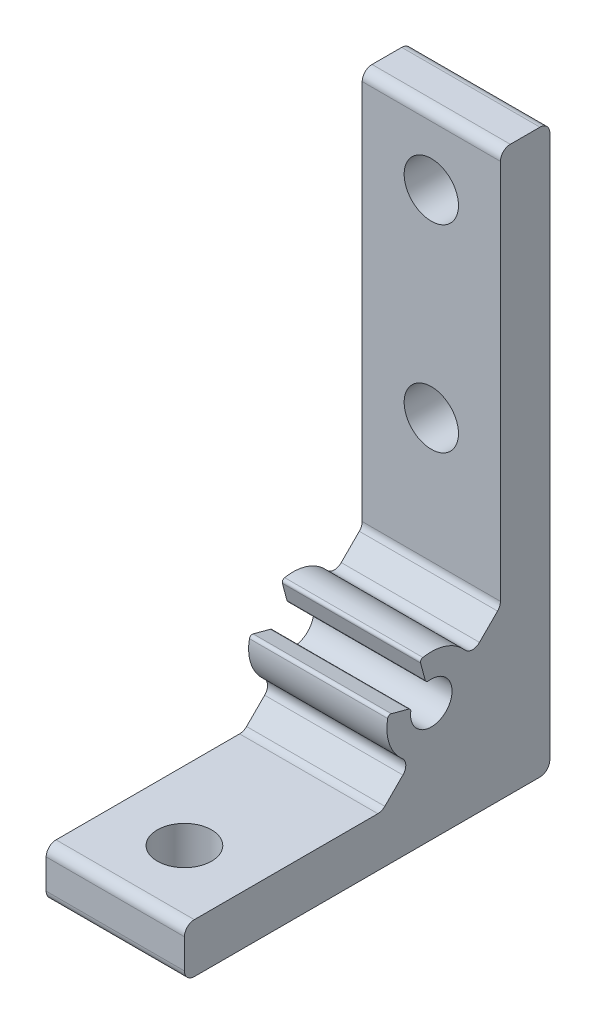
ISO-10303-21;
HEADER;
FILE_DESCRIPTION(('STEP AP214'),'2;1');
FILE_NAME('part.step','',(''),(''),'','','');
FILE_SCHEMA(('AUTOMOTIVE_DESIGN { 1 0 10303 214 1 1 1 1 }'));
ENDSEC;
DATA;
#1=APPLICATION_CONTEXT('core data for automotive mechanical design processes');
#2=APPLICATION_PROTOCOL_DEFINITION('international standard','automotive_design',2000,#1);
#3=PRODUCT_CONTEXT('',#1,'mechanical');
#4=PRODUCT('Part','Part','',(#3));
#5=PRODUCT_RELATED_PRODUCT_CATEGORY('part','',(#4));
#6=PRODUCT_DEFINITION_FORMATION('','',#4);
#7=PRODUCT_DEFINITION_CONTEXT('part definition',#1,'design');
#8=PRODUCT_DEFINITION('design','',#6,#7);
#9=PRODUCT_DEFINITION_SHAPE('','',#8);
#10=(LENGTH_UNIT() NAMED_UNIT(*) SI_UNIT(.MILLI.,.METRE.));
#11=(NAMED_UNIT(*) PLANE_ANGLE_UNIT() SI_UNIT($,.RADIAN.));
#12=(NAMED_UNIT(*) SI_UNIT($,.STERADIAN.) SOLID_ANGLE_UNIT());
#13=UNCERTAINTY_MEASURE_WITH_UNIT(LENGTH_MEASURE(1.E-05),#10,'distance_accuracy_value','');
#14=(GEOMETRIC_REPRESENTATION_CONTEXT(3) GLOBAL_UNCERTAINTY_ASSIGNED_CONTEXT((#13)) GLOBAL_UNIT_ASSIGNED_CONTEXT((#10,
#11,#12)) REPRESENTATION_CONTEXT('',''));
#15=CARTESIAN_POINT('',(0.,0.,0.));
#16=DIRECTION('',(0.,0.,1.));
#17=DIRECTION('',(1.,0.,0.));
#18=AXIS2_PLACEMENT_3D('',#15,#16,#17);
#19=CARTESIAN_POINT('',(7.,0.,36.));
#20=DIRECTION('',(0.,1.,0.));
#21=DIRECTION('',(0.,0.,1.));
#22=AXIS2_PLACEMENT_3D('',#19,#20,#21);
#23=PLANE('',#22);
#24=DIRECTION('',(-1.,0.,0.));
#25=VECTOR('',#24,1.);
#26=CARTESIAN_POINT('',(7.,0.,36.));
#27=LINE('',#26,#25);
#28=CARTESIAN_POINT('',(7.,0.,36.));
#29=VERTEX_POINT('',#28);
#30=CARTESIAN_POINT('',(-7.,0.,36.));
#31=VERTEX_POINT('',#30);
#32=EDGE_CURVE('E11',#29,#31,#27,.T.);
#33=ORIENTED_EDGE('',*,*,#32,.T.);
#34=DIRECTION('',(0.,0.,-1.));
#35=VECTOR('',#34,1.);
#36=CARTESIAN_POINT('',(-7.,0.,36.));
#37=LINE('',#36,#35);
#38=CARTESIAN_POINT('',(-7.,0.,1.));
#39=VERTEX_POINT('',#38);
#40=EDGE_CURVE('E208',#31,#39,#37,.T.);
#41=ORIENTED_EDGE('',*,*,#40,.T.);
#42=DIRECTION('',(-1.,0.,0.));
#43=VECTOR('',#42,1.);
#44=CARTESIAN_POINT('',(7.,0.,1.));
#45=LINE('',#44,#43);
#46=CARTESIAN_POINT('',(7.,0.,1.));
#47=VERTEX_POINT('',#46);
#48=EDGE_CURVE('E41',#47,#39,#45,.T.);
#49=ORIENTED_EDGE('',*,*,#48,.F.);
#50=DIRECTION('',(0.,0.,-1.));
#51=VECTOR('',#50,1.);
#52=CARTESIAN_POINT('',(7.,0.,36.));
#53=LINE('',#52,#51);
#54=EDGE_CURVE('E209',#29,#47,#53,.T.);
#55=ORIENTED_EDGE('',*,*,#54,.F.);
#56=EDGE_LOOP('',(#33,#41,#49,#55));
#57=FACE_BOUND('',#56,.T.);
#58=CARTESIAN_POINT('',(0.,0.,30.));
#59=DIRECTION('',(0.,1.,0.));
#60=DIRECTION('',(0.,0.,1.));
#61=AXIS2_PLACEMENT_3D('',#58,#59,#60);
#62=CIRCLE('',#61,2.75);
#63=CARTESIAN_POINT('',(0.,0.,32.75));
#64=VERTEX_POINT('',#63);
#65=EDGE_CURVE('E665',#64,#64,#62,.T.);
#66=ORIENTED_EDGE('',*,*,#65,.T.);
#67=EDGE_LOOP('',(#66));
#68=FACE_BOUND('',#67,.T.);
#69=ADVANCED_FACE('F33',(#57,#68),#23,.F.);
#70=CARTESIAN_POINT('',(7.,5.,17.414213562373));
#71=DIRECTION('',(0.,-1.,0.));
#72=DIRECTION('',(0.,0.,-1.));
#73=AXIS2_PLACEMENT_3D('',#70,#71,#72);
#74=PLANE('',#73);
#75=DIRECTION('',(-1.,0.,0.));
#76=VECTOR('',#75,1.);
#77=CARTESIAN_POINT('',(7.,5.,17.414213562373));
#78=LINE('',#77,#76);
#79=CARTESIAN_POINT('',(7.,5.,17.414213562373));
#80=VERTEX_POINT('',#79);
#81=CARTESIAN_POINT('',(-7.,5.,17.414213562373));
#82=VERTEX_POINT('',#81);
#83=EDGE_CURVE('E355',#80,#82,#78,.T.);
#84=ORIENTED_EDGE('',*,*,#83,.T.);
#85=DIRECTION('',(0.,0.,1.));
#86=VECTOR('',#85,1.);
#87=CARTESIAN_POINT('',(-7.,5.,17.414213562373));
#88=LINE('',#87,#86);
#89=CARTESIAN_POINT('',(-7.,5.,36.));
#90=VERTEX_POINT('',#89);
#91=EDGE_CURVE('E293',#82,#90,#88,.T.);
#92=ORIENTED_EDGE('',*,*,#91,.T.);
#93=DIRECTION('',(-1.,0.,0.));
#94=VECTOR('',#93,1.);
#95=CARTESIAN_POINT('',(7.,5.,36.));
#96=LINE('',#95,#94);
#97=CARTESIAN_POINT('',(7.,5.,36.));
#98=VERTEX_POINT('',#97);
#99=EDGE_CURVE('E353',#98,#90,#96,.T.);
#100=ORIENTED_EDGE('',*,*,#99,.F.);
#101=DIRECTION('',(0.,0.,1.));
#102=VECTOR('',#101,1.);
#103=CARTESIAN_POINT('',(7.,5.,17.414213562373));
#104=LINE('',#103,#102);
#105=EDGE_CURVE('E346',#80,#98,#104,.T.);
#106=ORIENTED_EDGE('',*,*,#105,.F.);
#107=EDGE_LOOP('',(#84,#92,#100,#106));
#108=FACE_BOUND('',#107,.T.);
#109=CARTESIAN_POINT('',(0.,5.,30.));
#110=DIRECTION('',(0.,1.,0.));
#111=DIRECTION('',(0.,0.,1.));
#112=AXIS2_PLACEMENT_3D('',#109,#110,#111);
#113=CIRCLE('',#112,2.75);
#114=CARTESIAN_POINT('',(0.,5.,32.75));
#115=VERTEX_POINT('',#114);
#116=EDGE_CURVE('E662',#115,#115,#113,.T.);
#117=ORIENTED_EDGE('',*,*,#116,.F.);
#118=EDGE_LOOP('',(#117));
#119=FACE_BOUND('',#118,.T.);
#120=ADVANCED_FACE('F506',(#108,#119),#74,.F.);
#121=CARTESIAN_POINT('',(7.,1.,0.));
#122=DIRECTION('',(0.,0.,1.));
#123=DIRECTION('',(1.,0.,0.));
#124=AXIS2_PLACEMENT_3D('',#121,#122,#123);
#125=PLANE('',#124);
#126=CARTESIAN_POINT('',(0.,30.,0.));
#127=DIRECTION('',(0.,0.,1.));
#128=DIRECTION('',(1.,0.,0.));
#129=AXIS2_PLACEMENT_3D('',#126,#127,#128);
#130=CIRCLE('',#129,2.75);
#131=CARTESIAN_POINT('',(2.75,30.,0.));
#132=VERTEX_POINT('',#131);
#133=EDGE_CURVE('E228',#132,#132,#130,.T.);
#134=ORIENTED_EDGE('',*,*,#133,.T.);
#135=EDGE_LOOP('',(#134));
#136=FACE_BOUND('',#135,.T.);
#137=DIRECTION('',(-1.,0.,0.));
#138=VECTOR('',#137,1.);
#139=CARTESIAN_POINT('',(7.,1.,0.));
#140=LINE('',#139,#138);
#141=CARTESIAN_POINT('',(7.,1.,0.));
#142=VERTEX_POINT('',#141);
#143=CARTESIAN_POINT('',(-7.,1.,0.));
#144=VERTEX_POINT('',#143);
#145=EDGE_CURVE('E395',#142,#144,#140,.T.);
#146=ORIENTED_EDGE('',*,*,#145,.T.);
#147=DIRECTION('',(0.,1.,0.));
#148=VECTOR('',#147,1.);
#149=CARTESIAN_POINT('',(-7.,1.,0.));
#150=LINE('',#149,#148);
#151=CARTESIAN_POINT('',(-7.,56.,0.));
#152=VERTEX_POINT('',#151);
#153=EDGE_CURVE('E233',#144,#152,#150,.T.);
#154=ORIENTED_EDGE('',*,*,#153,.T.);
#155=DIRECTION('',(-1.,0.,0.));
#156=VECTOR('',#155,1.);
#157=CARTESIAN_POINT('',(7.,56.,0.));
#158=LINE('',#157,#156);
#159=CARTESIAN_POINT('',(7.,56.,0.));
#160=VERTEX_POINT('',#159);
#161=EDGE_CURVE('E393',#160,#152,#158,.T.);
#162=ORIENTED_EDGE('',*,*,#161,.F.);
#163=DIRECTION('',(0.,1.,0.));
#164=VECTOR('',#163,1.);
#165=CARTESIAN_POINT('',(7.,1.,0.));
#166=LINE('',#165,#164);
#167=EDGE_CURVE('E306',#142,#160,#166,.T.);
#168=ORIENTED_EDGE('',*,*,#167,.F.);
#169=EDGE_LOOP('',(#146,#154,#162,#168));
#170=FACE_BOUND('',#169,.T.);
#171=CARTESIAN_POINT('',(0.,50.,0.));
#172=DIRECTION('',(0.,0.,1.));
#173=DIRECTION('',(1.,0.,0.));
#174=AXIS2_PLACEMENT_3D('',#171,#172,#173);
#175=CIRCLE('',#174,2.75);
#176=CARTESIAN_POINT('',(2.75,50.,0.));
#177=VERTEX_POINT('',#176);
#178=EDGE_CURVE('E667',#177,#177,#175,.T.);
#179=ORIENTED_EDGE('',*,*,#178,.T.);
#180=EDGE_LOOP('',(#179));
#181=FACE_BOUND('',#180,.T.);
#182=ADVANCED_FACE('F406',(#136,#170,#181),#125,.F.);
#183=CARTESIAN_POINT('',(7.,56.,5.));
#184=DIRECTION('',(0.,0.,-1.));
#185=DIRECTION('',(-1.,0.,0.));
#186=AXIS2_PLACEMENT_3D('',#183,#184,#185);
#187=PLANE('',#186);
#188=CARTESIAN_POINT('',(0.,30.,5.));
#189=DIRECTION('',(0.,0.,1.));
#190=DIRECTION('',(1.,0.,0.));
#191=AXIS2_PLACEMENT_3D('',#188,#189,#190);
#192=CIRCLE('',#191,2.75);
#193=CARTESIAN_POINT('',(2.75,30.,5.));
#194=VERTEX_POINT('',#193);
#195=EDGE_CURVE('E225',#194,#194,#192,.T.);
#196=ORIENTED_EDGE('',*,*,#195,.F.);
#197=EDGE_LOOP('',(#196));
#198=FACE_BOUND('',#197,.T.);
#199=DIRECTION('',(-1.,0.,0.));
#200=VECTOR('',#199,1.);
#201=CARTESIAN_POINT('',(7.,56.,5.));
#202=LINE('',#201,#200);
#203=CARTESIAN_POINT('',(7.,56.,5.));
#204=VERTEX_POINT('',#203);
#205=CARTESIAN_POINT('',(-7.,56.,5.));
#206=VERTEX_POINT('',#205);
#207=EDGE_CURVE('E387',#204,#206,#202,.T.);
#208=ORIENTED_EDGE('',*,*,#207,.T.);
#209=DIRECTION('',(0.,-1.,0.));
#210=VECTOR('',#209,1.);
#211=CARTESIAN_POINT('',(-7.,56.,5.));
#212=LINE('',#211,#210);
#213=CARTESIAN_POINT('',(-7.,17.414213562373,5.));
#214=VERTEX_POINT('',#213);
#215=EDGE_CURVE('E245',#206,#214,#212,.T.);
#216=ORIENTED_EDGE('',*,*,#215,.T.);
#217=DIRECTION('',(-1.,0.,0.));
#218=VECTOR('',#217,1.);
#219=CARTESIAN_POINT('',(7.,17.414213562373,5.));
#220=LINE('',#219,#218);
#221=CARTESIAN_POINT('',(7.,17.414213562373,5.));
#222=VERTEX_POINT('',#221);
#223=EDGE_CURVE('E385',#222,#214,#220,.T.);
#224=ORIENTED_EDGE('',*,*,#223,.F.);
#225=DIRECTION('',(0.,-1.,0.));
#226=VECTOR('',#225,1.);
#227=CARTESIAN_POINT('',(7.,56.,5.));
#228=LINE('',#227,#226);
#229=EDGE_CURVE('E314',#204,#222,#228,.T.);
#230=ORIENTED_EDGE('',*,*,#229,.F.);
#231=EDGE_LOOP('',(#208,#216,#224,#230));
#232=FACE_BOUND('',#231,.T.);
#233=CARTESIAN_POINT('',(0.,50.,5.));
#234=DIRECTION('',(0.,0.,1.));
#235=DIRECTION('',(1.,0.,0.));
#236=AXIS2_PLACEMENT_3D('',#233,#234,#235);
#237=CIRCLE('',#236,2.75);
#238=CARTESIAN_POINT('',(2.75,50.,5.));
#239=VERTEX_POINT('',#238);
#240=EDGE_CURVE('E670',#239,#239,#237,.T.);
#241=ORIENTED_EDGE('',*,*,#240,.F.);
#242=EDGE_LOOP('',(#241));
#243=FACE_BOUND('',#242,.T.);
#244=ADVANCED_FACE('F425',(#198,#232,#243),#187,.F.);
#245=CARTESIAN_POINT('',(7.,0.99999999999922,36.0000000000008));
#246=DIRECTION('',(-1.,0.,0.));
#247=DIRECTION('',(0.,0.,1.));
#248=AXIS2_PLACEMENT_3D('',#245,#246,#247);
#249=CYLINDRICAL_SURFACE('',#248,0.999999999999219);
#250=DIRECTION('',(-1.,0.,0.));
#251=VECTOR('',#250,1.);
#252=CARTESIAN_POINT('',(7.,1.,37.));
#253=LINE('',#252,#251);
#254=CARTESIAN_POINT('',(7.,1.,37.));
#255=VERTEX_POINT('',#254);
#256=CARTESIAN_POINT('',(-7.,1.,37.));
#257=VERTEX_POINT('',#256);
#258=EDGE_CURVE('E224',#255,#257,#253,.T.);
#259=ORIENTED_EDGE('',*,*,#258,.T.);
#260=CARTESIAN_POINT('',(-7.,0.99999999999922,36.0000000000008));
#261=DIRECTION('',(1.,0.,0.));
#262=DIRECTION('',(0.,0.,-1.));
#263=AXIS2_PLACEMENT_3D('',#260,#261,#262);
#264=CIRCLE('',#263,0.999999999999219);
#265=EDGE_CURVE('E218',#257,#31,#264,.T.);
#266=ORIENTED_EDGE('',*,*,#265,.T.);
#267=ORIENTED_EDGE('',*,*,#32,.F.);
#268=CARTESIAN_POINT('',(7.,0.99999999999922,36.0000000000008));
#269=DIRECTION('',(1.,0.,0.));
#270=DIRECTION('',(0.,0.,-1.));
#271=AXIS2_PLACEMENT_3D('',#268,#269,#270);
#272=CIRCLE('',#271,0.999999999999219);
#273=EDGE_CURVE('E301',#255,#29,#272,.T.);
#274=ORIENTED_EDGE('',*,*,#273,.F.);
#275=EDGE_LOOP('',(#259,#266,#267,#274));
#276=FACE_BOUND('',#275,.T.);
#277=ADVANCED_FACE('F35',(#276),#249,.T.);
#278=CARTESIAN_POINT('',(7.,0.999999999999992,0.999999999999992));
#279=DIRECTION('',(-1.,0.,0.));
#280=DIRECTION('',(0.,0.,1.));
#281=AXIS2_PLACEMENT_3D('',#278,#279,#280);
#282=CYLINDRICAL_SURFACE('',#281,0.999999999999992);
#283=ORIENTED_EDGE('',*,*,#48,.T.);
#284=CARTESIAN_POINT('',(-7.,0.999999999999992,0.999999999999992));
#285=DIRECTION('',(1.,0.,0.));
#286=DIRECTION('',(0.,0.,-1.));
#287=AXIS2_PLACEMENT_3D('',#284,#285,#286);
#288=CIRCLE('',#287,0.999999999999992);
#289=EDGE_CURVE('E222',#39,#144,#288,.T.);
#290=ORIENTED_EDGE('',*,*,#289,.T.);
#291=ORIENTED_EDGE('',*,*,#145,.F.);
#292=CARTESIAN_POINT('',(7.,0.999999999999992,0.999999999999992));
#293=DIRECTION('',(1.,0.,0.));
#294=DIRECTION('',(0.,0.,-1.));
#295=AXIS2_PLACEMENT_3D('',#292,#293,#294);
#296=CIRCLE('',#295,0.999999999999992);
#297=EDGE_CURVE('E304',#47,#142,#296,.T.);
#298=ORIENTED_EDGE('',*,*,#297,.F.);
#299=EDGE_LOOP('',(#283,#290,#291,#298));
#300=FACE_BOUND('',#299,.T.);
#301=ADVANCED_FACE('F398',(#300),#282,.T.);
#302=CARTESIAN_POINT('',(7.,56.0000000000008,0.999999999999232));
#303=DIRECTION('',(-1.,0.,0.));
#304=DIRECTION('',(0.,0.,1.));
#305=AXIS2_PLACEMENT_3D('',#302,#303,#304);
#306=CYLINDRICAL_SURFACE('',#305,0.999999999999231);
#307=ORIENTED_EDGE('',*,*,#161,.T.);
#308=CARTESIAN_POINT('',(-7.,56.0000000000008,0.999999999999232));
#309=DIRECTION('',(1.,0.,0.));
#310=DIRECTION('',(0.,0.,-1.));
#311=AXIS2_PLACEMENT_3D('',#308,#309,#310);
#312=CIRCLE('',#311,0.999999999999231);
#313=CARTESIAN_POINT('',(-7.,57.,1.));
#314=VERTEX_POINT('',#313);
#315=EDGE_CURVE('E236',#152,#314,#312,.T.);
#316=ORIENTED_EDGE('',*,*,#315,.T.);
#317=DIRECTION('',(-1.,0.,0.));
#318=VECTOR('',#317,1.);
#319=CARTESIAN_POINT('',(7.,57.,1.));
#320=LINE('',#319,#318);
#321=CARTESIAN_POINT('',(7.,57.,1.));
#322=VERTEX_POINT('',#321);
#323=EDGE_CURVE('E391',#322,#314,#320,.T.);
#324=ORIENTED_EDGE('',*,*,#323,.F.);
#325=CARTESIAN_POINT('',(7.,56.0000000000008,0.999999999999232));
#326=DIRECTION('',(1.,0.,0.));
#327=DIRECTION('',(0.,0.,-1.));
#328=AXIS2_PLACEMENT_3D('',#325,#326,#327);
#329=CIRCLE('',#328,0.999999999999231);
#330=EDGE_CURVE('E308',#160,#322,#329,.T.);
#331=ORIENTED_EDGE('',*,*,#330,.F.);
#332=EDGE_LOOP('',(#307,#316,#324,#331));
#333=FACE_BOUND('',#332,.T.);
#334=ADVANCED_FACE('F410',(#333),#306,.T.);
#335=CARTESIAN_POINT('',(7.,57.,1.));
#336=DIRECTION('',(0.,-1.,0.));
#337=DIRECTION('',(0.,0.,-1.));
#338=AXIS2_PLACEMENT_3D('',#335,#336,#337);
#339=PLANE('',#338);
#340=ORIENTED_EDGE('',*,*,#323,.T.);
#341=DIRECTION('',(0.,0.,1.));
#342=VECTOR('',#341,1.);
#343=CARTESIAN_POINT('',(-7.,57.,1.));
#344=LINE('',#343,#342);
#345=CARTESIAN_POINT('',(-7.,57.,4.));
#346=VERTEX_POINT('',#345);
#347=EDGE_CURVE('E239',#314,#346,#344,.T.);
#348=ORIENTED_EDGE('',*,*,#347,.T.);
#349=DIRECTION('',(-1.,0.,0.));
#350=VECTOR('',#349,1.);
#351=CARTESIAN_POINT('',(7.,57.,4.));
#352=LINE('',#351,#350);
#353=CARTESIAN_POINT('',(7.,57.,4.));
#354=VERTEX_POINT('',#353);
#355=EDGE_CURVE('E389',#354,#346,#352,.T.);
#356=ORIENTED_EDGE('',*,*,#355,.F.);
#357=DIRECTION('',(0.,0.,1.));
#358=VECTOR('',#357,1.);
#359=CARTESIAN_POINT('',(7.,57.,1.));
#360=LINE('',#359,#358);
#361=EDGE_CURVE('E310',#322,#354,#360,.T.);
#362=ORIENTED_EDGE('',*,*,#361,.F.);
#363=EDGE_LOOP('',(#340,#348,#356,#362));
#364=FACE_BOUND('',#363,.T.);
#365=ADVANCED_FACE('F415',(#364),#339,.F.);
#366=CARTESIAN_POINT('',(7.,56.0000000000007,4.00000000000068));
#367=DIRECTION('',(-1.,0.,0.));
#368=DIRECTION('',(0.,0.,1.));
#369=AXIS2_PLACEMENT_3D('',#366,#367,#368);
#370=CYLINDRICAL_SURFACE('',#369,0.999999999999316);
#371=ORIENTED_EDGE('',*,*,#355,.T.);
#372=CARTESIAN_POINT('',(-7.,56.0000000000007,4.00000000000068));
#373=DIRECTION('',(1.,0.,0.));
#374=DIRECTION('',(0.,0.,-1.));
#375=AXIS2_PLACEMENT_3D('',#372,#373,#374);
#376=CIRCLE('',#375,0.999999999999316);
#377=EDGE_CURVE('E242',#346,#206,#376,.T.);
#378=ORIENTED_EDGE('',*,*,#377,.T.);
#379=ORIENTED_EDGE('',*,*,#207,.F.);
#380=CARTESIAN_POINT('',(7.,56.0000000000007,4.00000000000068));
#381=DIRECTION('',(1.,0.,0.));
#382=DIRECTION('',(0.,0.,-1.));
#383=AXIS2_PLACEMENT_3D('',#380,#381,#382);
#384=CIRCLE('',#383,0.999999999999316);
#385=EDGE_CURVE('E312',#354,#204,#384,.T.);
#386=ORIENTED_EDGE('',*,*,#385,.F.);
#387=EDGE_LOOP('',(#371,#378,#379,#386));
#388=FACE_BOUND('',#387,.T.);
#389=ADVANCED_FACE('F421',(#388),#370,.T.);
#390=CARTESIAN_POINT('',(7.,17.4142135623726,5.99999999999751));
#391=DIRECTION('',(-1.,0.,0.));
#392=DIRECTION('',(0.,0.,1.));
#393=AXIS2_PLACEMENT_3D('',#390,#391,#392);
#394=CYLINDRICAL_SURFACE('',#393,0.999999999997506);
#395=ORIENTED_EDGE('',*,*,#223,.T.);
#396=CARTESIAN_POINT('',(-7.,17.4142135623726,5.99999999999751));
#397=DIRECTION('',(-1.,0.,0.));
#398=DIRECTION('',(0.,0.,1.));
#399=AXIS2_PLACEMENT_3D('',#396,#397,#398);
#400=CIRCLE('',#399,0.999999999997506);
#401=CARTESIAN_POINT('',(-7.,16.707106781187,5.2928932188135));
#402=VERTEX_POINT('',#401);
#403=EDGE_CURVE('E248',#214,#402,#400,.T.);
#404=ORIENTED_EDGE('',*,*,#403,.T.);
#405=DIRECTION('',(-1.,0.,0.));
#406=VECTOR('',#405,1.);
#407=CARTESIAN_POINT('',(7.,16.707106781187,5.2928932188135));
#408=LINE('',#407,#406);
#409=CARTESIAN_POINT('',(7.,16.707106781187,5.2928932188135));
#410=VERTEX_POINT('',#409);
#411=EDGE_CURVE('E383',#410,#402,#408,.T.);
#412=ORIENTED_EDGE('',*,*,#411,.F.);
#413=CARTESIAN_POINT('',(7.,17.4142135623726,5.99999999999751));
#414=DIRECTION('',(-1.,0.,0.));
#415=DIRECTION('',(0.,0.,1.));
#416=AXIS2_PLACEMENT_3D('',#413,#414,#415);
#417=CIRCLE('',#416,0.999999999997506);
#418=EDGE_CURVE('E316',#222,#410,#417,.T.);
#419=ORIENTED_EDGE('',*,*,#418,.F.);
#420=EDGE_LOOP('',(#395,#404,#412,#419));
#421=FACE_BOUND('',#420,.T.);
#422=ADVANCED_FACE('F431',(#421),#394,.F.);
#423=CARTESIAN_POINT('',(7.,16.707106781187,5.2928932188135));
#424=DIRECTION('',(0.,-0.70710678118647,-0.707106781186625));
#425=DIRECTION('',(0.,0.707106781186625,-0.70710678118647));
#426=AXIS2_PLACEMENT_3D('',#423,#424,#425);
#427=PLANE('',#426);
#428=ORIENTED_EDGE('',*,*,#411,.T.);
#429=DIRECTION('',(0.,-0.707106781186625,0.70710678118647));
#430=VECTOR('',#429,1.);
#431=CARTESIAN_POINT('',(-7.,16.707106781187,5.2928932188135));
#432=LINE('',#431,#430);
#433=CARTESIAN_POINT('',(-7.,14.878042491048,7.1219575089521));
#434=VERTEX_POINT('',#433);
#435=EDGE_CURVE('E251',#402,#434,#432,.T.);
#436=ORIENTED_EDGE('',*,*,#435,.T.);
#437=DIRECTION('',(-1.,0.,0.));
#438=VECTOR('',#437,1.);
#439=CARTESIAN_POINT('',(7.,14.878042491048,7.1219575089521));
#440=LINE('',#439,#438);
#441=CARTESIAN_POINT('',(7.,14.878042491048,7.1219575089521));
#442=VERTEX_POINT('',#441);
#443=EDGE_CURVE('E381',#442,#434,#440,.T.);
#444=ORIENTED_EDGE('',*,*,#443,.F.);
#445=DIRECTION('',(0.,-0.707106781186625,0.70710678118647));
#446=VECTOR('',#445,1.);
#447=CARTESIAN_POINT('',(7.,16.707106781187,5.2928932188135));
#448=LINE('',#447,#446);
#449=EDGE_CURVE('E318',#410,#442,#448,.T.);
#450=ORIENTED_EDGE('',*,*,#449,.F.);
#451=EDGE_LOOP('',(#428,#436,#444,#450));
#452=FACE_BOUND('',#451,.T.);
#453=ADVANCED_FACE('F437',(#452),#427,.F.);
#454=CARTESIAN_POINT('',(7.,15.585149272235,7.8290642901386));
#455=DIRECTION('',(-1.,0.,0.));
#456=DIRECTION('',(0.,0.,1.));
#457=AXIS2_PLACEMENT_3D('',#454,#455,#456);
#458=CYLINDRICAL_SURFACE('',#457,1.00000000000032);
#459=ORIENTED_EDGE('',*,*,#443,.T.);
#460=CARTESIAN_POINT('',(-7.,15.585149272235,7.8290642901386));
#461=DIRECTION('',(-1.,0.,0.));
#462=DIRECTION('',(0.,0.,1.));
#463=AXIS2_PLACEMENT_3D('',#460,#461,#462);
#464=CIRCLE('',#463,1.00000000000032);
#465=CARTESIAN_POINT('',(-7.,14.933303979908,8.587416263085));
#466=VERTEX_POINT('',#465);
#467=EDGE_CURVE('E254',#434,#466,#464,.T.);
#468=ORIENTED_EDGE('',*,*,#467,.T.);
#469=DIRECTION('',(-1.,0.,0.));
#470=VECTOR('',#469,1.);
#471=CARTESIAN_POINT('',(7.,14.933303979908,8.587416263085));
#472=LINE('',#471,#470);
#473=CARTESIAN_POINT('',(7.,14.933303979908,8.587416263085));
#474=VERTEX_POINT('',#473);
#475=EDGE_CURVE('E379',#474,#466,#472,.T.);
#476=ORIENTED_EDGE('',*,*,#475,.F.);
#477=CARTESIAN_POINT('',(7.,15.585149272235,7.8290642901386));
#478=DIRECTION('',(-1.,0.,0.));
#479=DIRECTION('',(0.,0.,1.));
#480=AXIS2_PLACEMENT_3D('',#477,#478,#479);
#481=CIRCLE('',#480,1.00000000000032);
#482=EDGE_CURVE('E320',#442,#474,#481,.T.);
#483=ORIENTED_EDGE('',*,*,#482,.F.);
#484=EDGE_LOOP('',(#459,#468,#476,#483));
#485=FACE_BOUND('',#484,.T.);
#486=ADVANCED_FACE('F441',(#485),#458,.F.);
#487=CARTESIAN_POINT('',(7.,12.0000000000021,11.9999999999993));
#488=DIRECTION('',(-1.,0.,0.));
#489=DIRECTION('',(0.,0.,1.));
#490=AXIS2_PLACEMENT_3D('',#487,#488,#489);
#491=CYLINDRICAL_SURFACE('',#490,4.49999999999816);
#492=ORIENTED_EDGE('',*,*,#475,.T.);
#493=CARTESIAN_POINT('',(-7.,12.0000000000021,11.9999999999993));
#494=DIRECTION('',(1.,0.,0.));
#495=DIRECTION('',(0.,0.,-1.));
#496=AXIS2_PLACEMENT_3D('',#493,#494,#495);
#497=CIRCLE('',#496,4.49999999999816);
#498=CARTESIAN_POINT('',(-7.,16.418755456335,12.851234525328));
#499=VERTEX_POINT('',#498);
#500=EDGE_CURVE('E257',#466,#499,#497,.T.);
#501=ORIENTED_EDGE('',*,*,#500,.T.);
#502=DIRECTION('',(-1.,0.,0.));
#503=VECTOR('',#502,1.);
#504=CARTESIAN_POINT('',(7.,16.418755456335,12.851234525328));
#505=LINE('',#504,#503);
#506=CARTESIAN_POINT('',(7.,16.418755456335,12.851234525328));
#507=VERTEX_POINT('',#506);
#508=EDGE_CURVE('E377',#507,#499,#505,.T.);
#509=ORIENTED_EDGE('',*,*,#508,.F.);
#510=CARTESIAN_POINT('',(7.,12.0000000000021,11.9999999999993));
#511=DIRECTION('',(1.,0.,0.));
#512=DIRECTION('',(0.,0.,-1.));
#513=AXIS2_PLACEMENT_3D('',#510,#511,#512);
#514=CIRCLE('',#513,4.49999999999816);
#515=EDGE_CURVE('E322',#474,#507,#514,.T.);
#516=ORIENTED_EDGE('',*,*,#515,.F.);
#517=EDGE_LOOP('',(#492,#501,#509,#516));
#518=FACE_BOUND('',#517,.T.);
#519=ADVANCED_FACE('F446',(#518),#491,.T.);
#520=CARTESIAN_POINT('',(7.,16.1241717443634,12.7944856342257));
#521=DIRECTION('',(-1.,0.,0.));
#522=DIRECTION('',(0.,0.,1.));
#523=AXIS2_PLACEMENT_3D('',#520,#521,#522);
#524=CYLINDRICAL_SURFACE('',#523,0.300000000000489);
#525=ORIENTED_EDGE('',*,*,#508,.T.);
#526=CARTESIAN_POINT('',(-7.,16.1241717443634,12.7944856342257));
#527=DIRECTION('',(1.,0.,0.));
#528=DIRECTION('',(0.,0.,-1.));
#529=AXIS2_PLACEMENT_3D('',#526,#527,#528);
#530=CIRCLE('',#529,0.300000000000489);
#531=CARTESIAN_POINT('',(-7.,16.046526030833,13.084263382113));
#532=VERTEX_POINT('',#531);
#533=EDGE_CURVE('E260',#499,#532,#530,.T.);
#534=ORIENTED_EDGE('',*,*,#533,.T.);
#535=DIRECTION('',(-1.,0.,0.));
#536=VECTOR('',#535,1.);
#537=CARTESIAN_POINT('',(7.,16.046526030833,13.084263382113));
#538=LINE('',#537,#536);
#539=CARTESIAN_POINT('',(7.,16.046526030833,13.084263382113));
#540=VERTEX_POINT('',#539);
#541=EDGE_CURVE('E375',#540,#532,#538,.T.);
#542=ORIENTED_EDGE('',*,*,#541,.F.);
#543=CARTESIAN_POINT('',(7.,16.1241717443634,12.7944856342257));
#544=DIRECTION('',(1.,0.,0.));
#545=DIRECTION('',(0.,0.,-1.));
#546=AXIS2_PLACEMENT_3D('',#543,#544,#545);
#547=CIRCLE('',#546,0.300000000000489);
#548=EDGE_CURVE('E324',#507,#540,#547,.T.);
#549=ORIENTED_EDGE('',*,*,#548,.F.);
#550=EDGE_LOOP('',(#525,#534,#542,#549));
#551=FACE_BOUND('',#550,.T.);
#552=ADVANCED_FACE('F452',(#551),#524,.T.);
#553=CARTESIAN_POINT('',(7.,16.046526030833,13.084263382113));
#554=DIRECTION('',(0.,0.258819045102231,-0.965925826289146));
#555=DIRECTION('',(0.,0.965925826289146,0.258819045102231));
#556=AXIS2_PLACEMENT_3D('',#553,#554,#555);
#557=PLANE('',#556);
#558=ORIENTED_EDGE('',*,*,#541,.T.);
#559=DIRECTION('',(0.,-0.965925826289146,-0.258819045102231));
#560=VECTOR('',#559,1.);
#561=CARTESIAN_POINT('',(-7.,16.046526030833,13.084263382113));
#562=LINE('',#561,#560);
#563=CARTESIAN_POINT('',(-7.,14.300039569166,12.616293745118));
#564=VERTEX_POINT('',#563);
#565=EDGE_CURVE('E263',#532,#564,#562,.T.);
#566=ORIENTED_EDGE('',*,*,#565,.T.);
#567=DIRECTION('',(-1.,0.,0.));
#568=VECTOR('',#567,1.);
#569=CARTESIAN_POINT('',(7.,14.300039569166,12.616293745118));
#570=LINE('',#569,#568);
#571=CARTESIAN_POINT('',(7.,14.300039569166,12.616293745118));
#572=VERTEX_POINT('',#571);
#573=EDGE_CURVE('E373',#572,#564,#570,.T.);
#574=ORIENTED_EDGE('',*,*,#573,.F.);
#575=DIRECTION('',(0.,-0.965925826289146,-0.258819045102231));
#576=VECTOR('',#575,1.);
#577=CARTESIAN_POINT('',(7.,16.046526030833,13.084263382113));
#578=LINE('',#577,#576);
#579=EDGE_CURVE('E326',#540,#572,#578,.T.);
#580=ORIENTED_EDGE('',*,*,#579,.F.);
#581=EDGE_LOOP('',(#558,#566,#574,#580));
#582=FACE_BOUND('',#581,.T.);
#583=ADVANCED_FACE('F456',(#582),#557,.F.);
#584=CARTESIAN_POINT('',(7.,14.3776852826953,12.3265159972324));
#585=DIRECTION('',(-1.,0.,0.));
#586=DIRECTION('',(0.,0.,1.));
#587=AXIS2_PLACEMENT_3D('',#584,#585,#586);
#588=CYLINDRICAL_SURFACE('',#587,0.299999999998507);
#589=ORIENTED_EDGE('',*,*,#573,.T.);
#590=CARTESIAN_POINT('',(-7.,14.3776852826953,12.3265159972324));
#591=DIRECTION('',(1.,0.,0.));
#592=DIRECTION('',(0.,0.,-1.));
#593=AXIS2_PLACEMENT_3D('',#590,#591,#592);
#594=CIRCLE('',#593,0.299999999998507);
#595=CARTESIAN_POINT('',(-7.,14.0804746170942,12.2857015359312));
#596=VERTEX_POINT('',#595);
#597=EDGE_CURVE('E266',#564,#596,#594,.T.);
#598=ORIENTED_EDGE('',*,*,#597,.T.);
#599=DIRECTION('',(-1.,0.,0.));
#600=VECTOR('',#599,1.);
#601=CARTESIAN_POINT('',(7.,14.0804746170942,12.2857015359312));
#602=LINE('',#601,#600);
#603=CARTESIAN_POINT('',(7.,14.0804746170942,12.2857015359312));
#604=VERTEX_POINT('',#603);
#605=EDGE_CURVE('E371',#604,#596,#602,.T.);
#606=ORIENTED_EDGE('',*,*,#605,.F.);
#607=CARTESIAN_POINT('',(7.,14.3776852826953,12.3265159972324));
#608=DIRECTION('',(1.,0.,0.));
#609=DIRECTION('',(0.,0.,-1.));
#610=AXIS2_PLACEMENT_3D('',#607,#608,#609);
#611=CIRCLE('',#610,0.299999999998507);
#612=EDGE_CURVE('E328',#572,#604,#611,.T.);
#613=ORIENTED_EDGE('',*,*,#612,.F.);
#614=EDGE_LOOP('',(#589,#598,#606,#613));
#615=FACE_BOUND('',#614,.T.);
#616=ADVANCED_FACE('F461',(#615),#588,.T.);
#617=CARTESIAN_POINT('',(7.,12.0000000000021,11.9999999999993));
#618=DIRECTION('',(-1.,0.,0.));
#619=DIRECTION('',(0.,0.,1.));
#620=AXIS2_PLACEMENT_3D('',#617,#618,#619);
#621=CYLINDRICAL_SURFACE('',#620,2.09999999999963);
#622=ORIENTED_EDGE('',*,*,#605,.T.);
#623=CARTESIAN_POINT('',(-7.,12.0000000000021,11.9999999999993));
#624=DIRECTION('',(-1.,0.,0.));
#625=DIRECTION('',(0.,0.,1.));
#626=AXIS2_PLACEMENT_3D('',#623,#624,#625);
#627=CIRCLE('',#626,2.09999999999963);
#628=CARTESIAN_POINT('',(-7.,12.285701497577,14.08047462236));
#629=VERTEX_POINT('',#628);
#630=EDGE_CURVE('E269',#596,#629,#627,.T.);
#631=ORIENTED_EDGE('',*,*,#630,.T.);
#632=DIRECTION('',(-1.,0.,0.));
#633=VECTOR('',#632,1.);
#634=CARTESIAN_POINT('',(7.,12.285701497577,14.08047462236));
#635=LINE('',#634,#633);
#636=CARTESIAN_POINT('',(7.,12.285701497577,14.08047462236));
#637=VERTEX_POINT('',#636);
#638=EDGE_CURVE('E369',#637,#629,#635,.T.);
#639=ORIENTED_EDGE('',*,*,#638,.F.);
#640=CARTESIAN_POINT('',(7.,12.0000000000021,11.9999999999993));
#641=DIRECTION('',(-1.,0.,0.));
#642=DIRECTION('',(0.,0.,1.));
#643=AXIS2_PLACEMENT_3D('',#640,#641,#642);
#644=CIRCLE('',#643,2.09999999999963);
#645=EDGE_CURVE('E330',#604,#637,#644,.T.);
#646=ORIENTED_EDGE('',*,*,#645,.F.);
#647=EDGE_LOOP('',(#622,#631,#639,#646));
#648=FACE_BOUND('',#647,.T.);
#649=ADVANCED_FACE('F467',(#648),#621,.F.);
#650=CARTESIAN_POINT('',(7.,12.3265159972325,14.3776852826953));
#651=DIRECTION('',(-1.,0.,0.));
#652=DIRECTION('',(0.,0.,1.));
#653=AXIS2_PLACEMENT_3D('',#650,#651,#652);
#654=CYLINDRICAL_SURFACE('',#653,0.299999999998444);
#655=ORIENTED_EDGE('',*,*,#638,.T.);
#656=CARTESIAN_POINT('',(-7.,12.3265159972325,14.3776852826953));
#657=DIRECTION('',(1.,0.,0.));
#658=DIRECTION('',(0.,0.,-1.));
#659=AXIS2_PLACEMENT_3D('',#656,#657,#658);
#660=CIRCLE('',#659,0.299999999998444);
#661=CARTESIAN_POINT('',(-7.,12.616293745118,14.300039569166));
#662=VERTEX_POINT('',#661);
#663=EDGE_CURVE('E272',#629,#662,#660,.T.);
#664=ORIENTED_EDGE('',*,*,#663,.T.);
#665=DIRECTION('',(-1.,0.,0.));
#666=VECTOR('',#665,1.);
#667=CARTESIAN_POINT('',(7.,12.616293745118,14.300039569166));
#668=LINE('',#667,#666);
#669=CARTESIAN_POINT('',(7.,12.616293745118,14.300039569166));
#670=VERTEX_POINT('',#669);
#671=EDGE_CURVE('E367',#670,#662,#668,.T.);
#672=ORIENTED_EDGE('',*,*,#671,.F.);
#673=CARTESIAN_POINT('',(7.,12.3265159972325,14.3776852826953));
#674=DIRECTION('',(1.,0.,0.));
#675=DIRECTION('',(0.,0.,-1.));
#676=AXIS2_PLACEMENT_3D('',#673,#674,#675);
#677=CIRCLE('',#676,0.299999999998444);
#678=EDGE_CURVE('E332',#637,#670,#677,.T.);
#679=ORIENTED_EDGE('',*,*,#678,.F.);
#680=EDGE_LOOP('',(#655,#664,#672,#679));
#681=FACE_BOUND('',#680,.T.);
#682=ADVANCED_FACE('F471',(#681),#654,.T.);
#683=CARTESIAN_POINT('',(7.,12.616293745118,14.300039569166));
#684=DIRECTION('',(0.,-0.965925826289146,0.258819045102231));
#685=DIRECTION('',(0.,-0.258819045102231,-0.965925826289146));
#686=AXIS2_PLACEMENT_3D('',#683,#684,#685);
#687=PLANE('',#686);
#688=ORIENTED_EDGE('',*,*,#671,.T.);
#689=DIRECTION('',(0.,0.258819045102231,0.965925826289146));
#690=VECTOR('',#689,1.);
#691=CARTESIAN_POINT('',(-7.,12.616293745118,14.300039569166));
#692=LINE('',#691,#690);
#693=CARTESIAN_POINT('',(-7.,13.084263382113,16.046526030833));
#694=VERTEX_POINT('',#693);
#695=EDGE_CURVE('E275',#662,#694,#692,.T.);
#696=ORIENTED_EDGE('',*,*,#695,.T.);
#697=DIRECTION('',(-1.,0.,0.));
#698=VECTOR('',#697,1.);
#699=CARTESIAN_POINT('',(7.,13.084263382113,16.046526030833));
#700=LINE('',#699,#698);
#701=CARTESIAN_POINT('',(7.,13.084263382113,16.046526030833));
#702=VERTEX_POINT('',#701);
#703=EDGE_CURVE('E365',#702,#694,#700,.T.);
#704=ORIENTED_EDGE('',*,*,#703,.F.);
#705=DIRECTION('',(0.,0.258819045102231,0.965925826289146));
#706=VECTOR('',#705,1.);
#707=CARTESIAN_POINT('',(7.,12.616293745118,14.300039569166));
#708=LINE('',#707,#706);
#709=EDGE_CURVE('E334',#670,#702,#708,.T.);
#710=ORIENTED_EDGE('',*,*,#709,.F.);
#711=EDGE_LOOP('',(#688,#696,#704,#710));
#712=FACE_BOUND('',#711,.T.);
#713=ADVANCED_FACE('F476',(#712),#687,.F.);
#714=CARTESIAN_POINT('',(7.,12.7944856342265,16.1241717443635));
#715=DIRECTION('',(-1.,0.,0.));
#716=DIRECTION('',(0.,0.,1.));
#717=AXIS2_PLACEMENT_3D('',#714,#715,#716);
#718=CYLINDRICAL_SURFACE('',#717,0.29999999999977);
#719=ORIENTED_EDGE('',*,*,#703,.T.);
#720=CARTESIAN_POINT('',(-7.,12.7944856342265,16.1241717443635));
#721=DIRECTION('',(1.,0.,0.));
#722=DIRECTION('',(0.,0.,-1.));
#723=AXIS2_PLACEMENT_3D('',#720,#721,#722);
#724=CIRCLE('',#723,0.29999999999977);
#725=CARTESIAN_POINT('',(-7.,12.8512346412252,16.4187554340089));
#726=VERTEX_POINT('',#725);
#727=EDGE_CURVE('E278',#694,#726,#724,.T.);
#728=ORIENTED_EDGE('',*,*,#727,.T.);
#729=DIRECTION('',(-1.,0.,0.));
#730=VECTOR('',#729,1.);
#731=CARTESIAN_POINT('',(7.,12.8512346412252,16.4187554340089));
#732=LINE('',#731,#730);
#733=CARTESIAN_POINT('',(7.,12.8512346412252,16.4187554340089));
#734=VERTEX_POINT('',#733);
#735=EDGE_CURVE('E363',#734,#726,#732,.T.);
#736=ORIENTED_EDGE('',*,*,#735,.F.);
#737=CARTESIAN_POINT('',(7.,12.7944856342265,16.1241717443635));
#738=DIRECTION('',(1.,0.,0.));
#739=DIRECTION('',(0.,0.,-1.));
#740=AXIS2_PLACEMENT_3D('',#737,#738,#739);
#741=CIRCLE('',#740,0.29999999999977);
#742=EDGE_CURVE('E336',#702,#734,#741,.T.);
#743=ORIENTED_EDGE('',*,*,#742,.F.);
#744=EDGE_LOOP('',(#719,#728,#736,#743));
#745=FACE_BOUND('',#744,.T.);
#746=ADVANCED_FACE('F482',(#745),#718,.T.);
#747=CARTESIAN_POINT('',(7.,12.0000000000021,11.9999999999993));
#748=DIRECTION('',(-1.,0.,0.));
#749=DIRECTION('',(0.,0.,1.));
#750=AXIS2_PLACEMENT_3D('',#747,#748,#749);
#751=CYLINDRICAL_SURFACE('',#750,4.50000000000093);
#752=ORIENTED_EDGE('',*,*,#735,.T.);
#753=CARTESIAN_POINT('',(-7.,12.0000000000021,11.9999999999993));
#754=DIRECTION('',(1.,0.,0.));
#755=DIRECTION('',(0.,0.,-1.));
#756=AXIS2_PLACEMENT_3D('',#753,#754,#755);
#757=CIRCLE('',#756,4.50000000000093);
#758=CARTESIAN_POINT('',(-7.,8.5874162923326,14.933304013934));
#759=VERTEX_POINT('',#758);
#760=EDGE_CURVE('E281',#726,#759,#757,.T.);
#761=ORIENTED_EDGE('',*,*,#760,.T.);
#762=DIRECTION('',(-1.,0.,0.));
#763=VECTOR('',#762,1.);
#764=CARTESIAN_POINT('',(7.,8.5874162923326,14.933304013934));
#765=LINE('',#764,#763);
#766=CARTESIAN_POINT('',(7.,8.5874162923326,14.933304013934));
#767=VERTEX_POINT('',#766);
#768=EDGE_CURVE('E361',#767,#759,#765,.T.);
#769=ORIENTED_EDGE('',*,*,#768,.F.);
#770=CARTESIAN_POINT('',(7.,12.0000000000021,11.9999999999993));
#771=DIRECTION('',(1.,0.,0.));
#772=DIRECTION('',(0.,0.,-1.));
#773=AXIS2_PLACEMENT_3D('',#770,#771,#772);
#774=CIRCLE('',#773,4.50000000000093);
#775=EDGE_CURVE('E338',#734,#767,#774,.T.);
#776=ORIENTED_EDGE('',*,*,#775,.F.);
#777=EDGE_LOOP('',(#752,#761,#769,#776));
#778=FACE_BOUND('',#777,.T.);
#779=ADVANCED_FACE('F486',(#778),#751,.T.);
#780=CARTESIAN_POINT('',(7.,7.82906429013878,15.5851492722355));
#781=DIRECTION('',(-1.,0.,0.));
#782=DIRECTION('',(0.,0.,1.));
#783=AXIS2_PLACEMENT_3D('',#780,#781,#782);
#784=CYLINDRICAL_SURFACE('',#783,1.00000000000077);
#785=ORIENTED_EDGE('',*,*,#768,.T.);
#786=CARTESIAN_POINT('',(-7.,7.82906429013878,15.5851492722355));
#787=DIRECTION('',(-1.,0.,0.));
#788=DIRECTION('',(0.,0.,1.));
#789=AXIS2_PLACEMENT_3D('',#786,#787,#788);
#790=CIRCLE('',#789,1.00000000000077);
#791=CARTESIAN_POINT('',(-7.,7.1219575089521,14.878042491048));
#792=VERTEX_POINT('',#791);
#793=EDGE_CURVE('E284',#759,#792,#790,.T.);
#794=ORIENTED_EDGE('',*,*,#793,.T.);
#795=DIRECTION('',(-1.,0.,0.));
#796=VECTOR('',#795,1.);
#797=CARTESIAN_POINT('',(7.,7.1219575089521,14.878042491048));
#798=LINE('',#797,#796);
#799=CARTESIAN_POINT('',(7.,7.1219575089521,14.878042491048));
#800=VERTEX_POINT('',#799);
#801=EDGE_CURVE('E359',#800,#792,#798,.T.);
#802=ORIENTED_EDGE('',*,*,#801,.F.);
#803=CARTESIAN_POINT('',(7.,7.82906429013878,15.5851492722355));
#804=DIRECTION('',(-1.,0.,0.));
#805=DIRECTION('',(0.,0.,1.));
#806=AXIS2_PLACEMENT_3D('',#803,#804,#805);
#807=CIRCLE('',#806,1.00000000000077);
#808=EDGE_CURVE('E340',#767,#800,#807,.T.);
#809=ORIENTED_EDGE('',*,*,#808,.F.);
#810=EDGE_LOOP('',(#785,#794,#802,#809));
#811=FACE_BOUND('',#810,.T.);
#812=ADVANCED_FACE('F491',(#811),#784,.F.);
#813=CARTESIAN_POINT('',(7.,7.1219575089521,14.878042491048));
#814=DIRECTION('',(0.,-0.707106781186625,-0.70710678118647));
#815=DIRECTION('',(0.,0.70710678118647,-0.707106781186625));
#816=AXIS2_PLACEMENT_3D('',#813,#814,#815);
#817=PLANE('',#816);
#818=ORIENTED_EDGE('',*,*,#801,.T.);
#819=DIRECTION('',(0.,-0.70710678118647,0.707106781186625));
#820=VECTOR('',#819,1.);
#821=CARTESIAN_POINT('',(-7.,7.1219575089521,14.878042491048));
#822=LINE('',#821,#820);
#823=CARTESIAN_POINT('',(-7.,5.2928932188135,16.707106781187));
#824=VERTEX_POINT('',#823);
#825=EDGE_CURVE('E287',#792,#824,#822,.T.);
#826=ORIENTED_EDGE('',*,*,#825,.T.);
#827=DIRECTION('',(-1.,0.,0.));
#828=VECTOR('',#827,1.);
#829=CARTESIAN_POINT('',(7.,5.2928932188135,16.707106781187));
#830=LINE('',#829,#828);
#831=CARTESIAN_POINT('',(7.,5.2928932188135,16.707106781187));
#832=VERTEX_POINT('',#831);
#833=EDGE_CURVE('E357',#832,#824,#830,.T.);
#834=ORIENTED_EDGE('',*,*,#833,.F.);
#835=DIRECTION('',(0.,-0.70710678118647,0.707106781186625));
#836=VECTOR('',#835,1.);
#837=CARTESIAN_POINT('',(7.,7.1219575089521,14.878042491048));
#838=LINE('',#837,#836);
#839=EDGE_CURVE('E342',#800,#832,#838,.T.);
#840=ORIENTED_EDGE('',*,*,#839,.F.);
#841=EDGE_LOOP('',(#818,#826,#834,#840));
#842=FACE_BOUND('',#841,.T.);
#843=ADVANCED_FACE('F497',(#842),#817,.F.);
#844=CARTESIAN_POINT('',(7.,5.99999999999751,17.4142135623726));
#845=DIRECTION('',(-1.,0.,0.));
#846=DIRECTION('',(0.,0.,1.));
#847=AXIS2_PLACEMENT_3D('',#844,#845,#846);
#848=CYLINDRICAL_SURFACE('',#847,0.999999999997507);
#849=ORIENTED_EDGE('',*,*,#833,.T.);
#850=CARTESIAN_POINT('',(-7.,5.99999999999751,17.4142135623726));
#851=DIRECTION('',(-1.,0.,0.));
#852=DIRECTION('',(0.,0.,1.));
#853=AXIS2_PLACEMENT_3D('',#850,#851,#852);
#854=CIRCLE('',#853,0.999999999997507);
#855=EDGE_CURVE('E290',#824,#82,#854,.T.);
#856=ORIENTED_EDGE('',*,*,#855,.T.);
#857=ORIENTED_EDGE('',*,*,#83,.F.);
#858=CARTESIAN_POINT('',(7.,5.99999999999751,17.4142135623726));
#859=DIRECTION('',(-1.,0.,0.));
#860=DIRECTION('',(0.,0.,1.));
#861=AXIS2_PLACEMENT_3D('',#858,#859,#860);
#862=CIRCLE('',#861,0.999999999997507);
#863=EDGE_CURVE('E344',#832,#80,#862,.T.);
#864=ORIENTED_EDGE('',*,*,#863,.F.);
#865=EDGE_LOOP('',(#849,#856,#857,#864));
#866=FACE_BOUND('',#865,.T.);
#867=ADVANCED_FACE('F501',(#866),#848,.F.);
#868=CARTESIAN_POINT('',(7.,4.00000000000069,36.0000000000007));
#869=DIRECTION('',(-1.,0.,0.));
#870=DIRECTION('',(0.,0.,1.));
#871=AXIS2_PLACEMENT_3D('',#868,#869,#870);
#872=CYLINDRICAL_SURFACE('',#871,0.999999999999307);
#873=ORIENTED_EDGE('',*,*,#99,.T.);
#874=CARTESIAN_POINT('',(-7.,4.00000000000069,36.0000000000007));
#875=DIRECTION('',(1.,0.,0.));
#876=DIRECTION('',(0.,0.,-1.));
#877=AXIS2_PLACEMENT_3D('',#874,#875,#876);
#878=CIRCLE('',#877,0.999999999999307);
#879=CARTESIAN_POINT('',(-7.,4.,37.));
#880=VERTEX_POINT('',#879);
#881=EDGE_CURVE('E296',#90,#880,#878,.T.);
#882=ORIENTED_EDGE('',*,*,#881,.T.);
#883=DIRECTION('',(-1.,0.,0.));
#884=VECTOR('',#883,1.);
#885=CARTESIAN_POINT('',(7.,4.,37.));
#886=LINE('',#885,#884);
#887=CARTESIAN_POINT('',(7.,4.,37.));
#888=VERTEX_POINT('',#887);
#889=EDGE_CURVE('E351',#888,#880,#886,.T.);
#890=ORIENTED_EDGE('',*,*,#889,.F.);
#891=CARTESIAN_POINT('',(7.,4.00000000000069,36.0000000000007));
#892=DIRECTION('',(1.,0.,0.));
#893=DIRECTION('',(0.,0.,-1.));
#894=AXIS2_PLACEMENT_3D('',#891,#892,#893);
#895=CIRCLE('',#894,0.999999999999307);
#896=EDGE_CURVE('E53',#98,#888,#895,.T.);
#897=ORIENTED_EDGE('',*,*,#896,.F.);
#898=EDGE_LOOP('',(#873,#882,#890,#897));
#899=FACE_BOUND('',#898,.T.);
#900=ADVANCED_FACE('F510',(#899),#872,.T.);
#901=CARTESIAN_POINT('',(7.,4.,37.));
#902=DIRECTION('',(0.,0.,-1.));
#903=DIRECTION('',(-1.,0.,0.));
#904=AXIS2_PLACEMENT_3D('',#901,#902,#903);
#905=PLANE('',#904);
#906=ORIENTED_EDGE('',*,*,#889,.T.);
#907=DIRECTION('',(0.,-1.,0.));
#908=VECTOR('',#907,1.);
#909=CARTESIAN_POINT('',(-7.,4.,37.));
#910=LINE('',#909,#908);
#911=EDGE_CURVE('E299',#880,#257,#910,.T.);
#912=ORIENTED_EDGE('',*,*,#911,.T.);
#913=ORIENTED_EDGE('',*,*,#258,.F.);
#914=DIRECTION('',(0.,-1.,0.));
#915=VECTOR('',#914,1.);
#916=CARTESIAN_POINT('',(7.,4.,37.));
#917=LINE('',#916,#915);
#918=EDGE_CURVE('E48',#888,#255,#917,.T.);
#919=ORIENTED_EDGE('',*,*,#918,.F.);
#920=EDGE_LOOP('',(#906,#912,#913,#919));
#921=FACE_BOUND('',#920,.T.);
#922=ADVANCED_FACE('F512',(#921),#905,.F.);
#923=CARTESIAN_POINT('',(7.,0.99999999999922,36.0000000000008));
#924=DIRECTION('',(1.,0.,0.));
#925=DIRECTION('',(0.,0.,-1.));
#926=AXIS2_PLACEMENT_3D('',#923,#924,#925);
#927=PLANE('',#926);
#928=ORIENTED_EDGE('',*,*,#273,.T.);
#929=ORIENTED_EDGE('',*,*,#54,.T.);
#930=ORIENTED_EDGE('',*,*,#297,.T.);
#931=ORIENTED_EDGE('',*,*,#167,.T.);
#932=ORIENTED_EDGE('',*,*,#330,.T.);
#933=ORIENTED_EDGE('',*,*,#361,.T.);
#934=ORIENTED_EDGE('',*,*,#385,.T.);
#935=ORIENTED_EDGE('',*,*,#229,.T.);
#936=ORIENTED_EDGE('',*,*,#418,.T.);
#937=ORIENTED_EDGE('',*,*,#449,.T.);
#938=ORIENTED_EDGE('',*,*,#482,.T.);
#939=ORIENTED_EDGE('',*,*,#515,.T.);
#940=ORIENTED_EDGE('',*,*,#548,.T.);
#941=ORIENTED_EDGE('',*,*,#579,.T.);
#942=ORIENTED_EDGE('',*,*,#612,.T.);
#943=ORIENTED_EDGE('',*,*,#645,.T.);
#944=ORIENTED_EDGE('',*,*,#678,.T.);
#945=ORIENTED_EDGE('',*,*,#709,.T.);
#946=ORIENTED_EDGE('',*,*,#742,.T.);
#947=ORIENTED_EDGE('',*,*,#775,.T.);
#948=ORIENTED_EDGE('',*,*,#808,.T.);
#949=ORIENTED_EDGE('',*,*,#839,.T.);
#950=ORIENTED_EDGE('',*,*,#863,.T.);
#951=ORIENTED_EDGE('',*,*,#105,.T.);
#952=ORIENTED_EDGE('',*,*,#896,.T.);
#953=ORIENTED_EDGE('',*,*,#918,.T.);
#954=EDGE_LOOP('',(#928,#929,#930,#931,#932,#933,#934,#935,#936,#937,#938,#939,#940,#941,#942,
#943,#944,#945,#946,#947,#948,#949,#950,#951,#952,#953));
#955=FACE_BOUND('',#954,.T.);
#956=ADVANCED_FACE('F401',(#955),#927,.T.);
#957=CARTESIAN_POINT('',(-7.,0.99999999999922,36.0000000000008));
#958=DIRECTION('',(1.,0.,0.));
#959=DIRECTION('',(0.,0.,-1.));
#960=AXIS2_PLACEMENT_3D('',#957,#958,#959);
#961=PLANE('',#960);
#962=ORIENTED_EDGE('',*,*,#265,.F.);
#963=ORIENTED_EDGE('',*,*,#911,.F.);
#964=ORIENTED_EDGE('',*,*,#881,.F.);
#965=ORIENTED_EDGE('',*,*,#91,.F.);
#966=ORIENTED_EDGE('',*,*,#855,.F.);
#967=ORIENTED_EDGE('',*,*,#825,.F.);
#968=ORIENTED_EDGE('',*,*,#793,.F.);
#969=ORIENTED_EDGE('',*,*,#760,.F.);
#970=ORIENTED_EDGE('',*,*,#727,.F.);
#971=ORIENTED_EDGE('',*,*,#695,.F.);
#972=ORIENTED_EDGE('',*,*,#663,.F.);
#973=ORIENTED_EDGE('',*,*,#630,.F.);
#974=ORIENTED_EDGE('',*,*,#597,.F.);
#975=ORIENTED_EDGE('',*,*,#565,.F.);
#976=ORIENTED_EDGE('',*,*,#533,.F.);
#977=ORIENTED_EDGE('',*,*,#500,.F.);
#978=ORIENTED_EDGE('',*,*,#467,.F.);
#979=ORIENTED_EDGE('',*,*,#435,.F.);
#980=ORIENTED_EDGE('',*,*,#403,.F.);
#981=ORIENTED_EDGE('',*,*,#215,.F.);
#982=ORIENTED_EDGE('',*,*,#377,.F.);
#983=ORIENTED_EDGE('',*,*,#347,.F.);
#984=ORIENTED_EDGE('',*,*,#315,.F.);
#985=ORIENTED_EDGE('',*,*,#153,.F.);
#986=ORIENTED_EDGE('',*,*,#289,.F.);
#987=ORIENTED_EDGE('',*,*,#40,.F.);
#988=EDGE_LOOP('',(#962,#963,#964,#965,#966,#967,#968,#969,#970,#971,#972,#973,#974,#975,#976,
#977,#978,#979,#980,#981,#982,#983,#984,#985,#986,#987));
#989=FACE_BOUND('',#988,.T.);
#990=ADVANCED_FACE('F216',(#989),#961,.F.);
#991=CARTESIAN_POINT('',(0.,30.,5.));
#992=DIRECTION('',(0.,0.,-1.));
#993=DIRECTION('',(-1.,0.,0.));
#994=AXIS2_PLACEMENT_3D('',#991,#992,#993);
#995=CYLINDRICAL_SURFACE('',#994,2.75);
#996=ORIENTED_EDGE('',*,*,#195,.T.);
#997=EDGE_LOOP('',(#996));
#998=FACE_BOUND('',#997,.T.);
#999=ORIENTED_EDGE('',*,*,#133,.F.);
#1000=EDGE_LOOP('',(#999));
#1001=FACE_BOUND('',#1000,.T.);
#1002=ADVANCED_FACE('F599',(#998,#1001),#995,.F.);
#1003=CARTESIAN_POINT('',(0.,50.,5.));
#1004=DIRECTION('',(0.,0.,-1.));
#1005=DIRECTION('',(-1.,0.,0.));
#1006=AXIS2_PLACEMENT_3D('',#1003,#1004,#1005);
#1007=CYLINDRICAL_SURFACE('',#1006,2.75);
#1008=ORIENTED_EDGE('',*,*,#240,.T.);
#1009=EDGE_LOOP('',(#1008));
#1010=FACE_BOUND('',#1009,.T.);
#1011=ORIENTED_EDGE('',*,*,#178,.F.);
#1012=EDGE_LOOP('',(#1011));
#1013=FACE_BOUND('',#1012,.T.);
#1014=ADVANCED_FACE('F608',(#1010,#1013),#1007,.F.);
#1015=CARTESIAN_POINT('',(0.,5.,30.));
#1016=DIRECTION('',(0.,-1.,0.));
#1017=DIRECTION('',(0.,0.,-1.));
#1018=AXIS2_PLACEMENT_3D('',#1015,#1016,#1017);
#1019=CYLINDRICAL_SURFACE('',#1018,2.75);
#1020=ORIENTED_EDGE('',*,*,#116,.T.);
#1021=EDGE_LOOP('',(#1020));
#1022=FACE_BOUND('',#1021,.T.);
#1023=ORIENTED_EDGE('',*,*,#65,.F.);
#1024=EDGE_LOOP('',(#1023));
#1025=FACE_BOUND('',#1024,.T.);
#1026=ADVANCED_FACE('F632',(#1022,#1025),#1019,.F.);
#1027=CLOSED_SHELL('',(#69,#120,#182,#244,#277,#301,#334,#365,#389,#422,#453,#486,#519,#552,
#583,#616,#649,#682,#713,#746,#779,#812,#843,#867,#900,#922,#956,#990,#1002,#1014,#1026));
#1028=MANIFOLD_SOLID_BREP('B2',#1027);
#1029=ADVANCED_BREP_SHAPE_REPRESENTATION('',(#18,#1028),#14);
#1030=SHAPE_DEFINITION_REPRESENTATION(#9,#1029);
ENDSEC;
END-ISO-10303-21;
